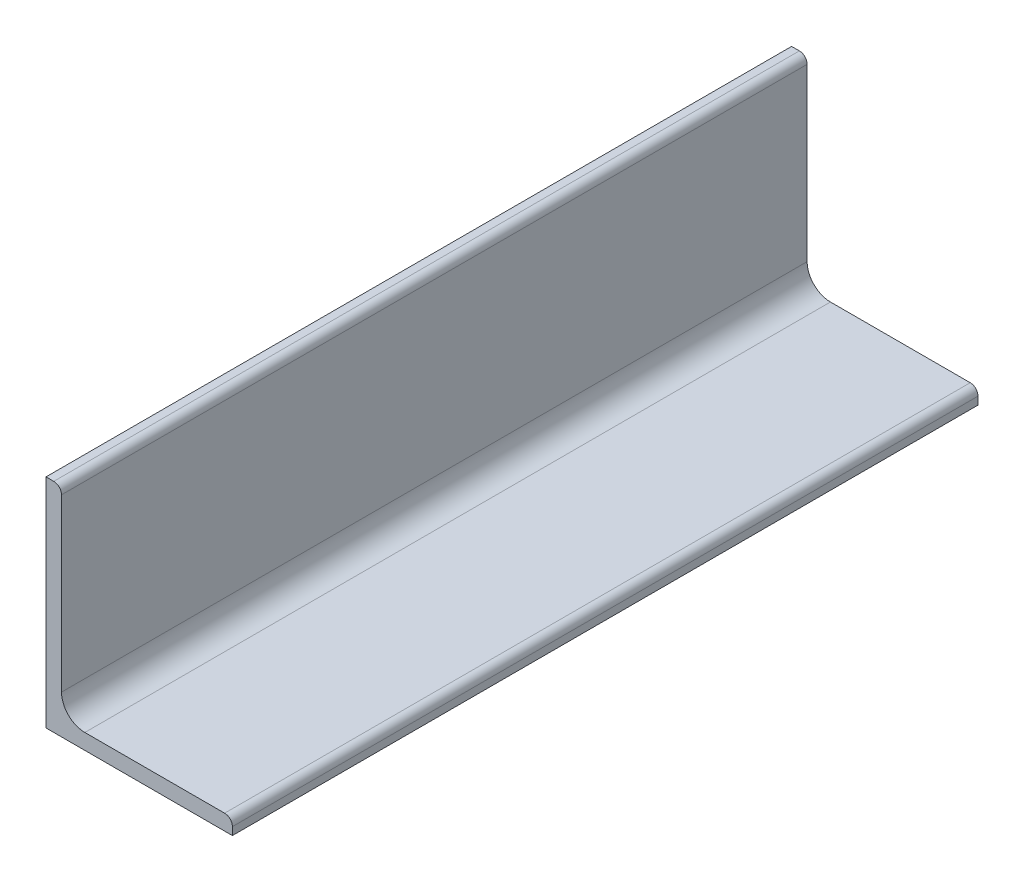
ISO-10303-21;
HEADER;
FILE_DESCRIPTION(('STEP AP214'),'2;1');
FILE_NAME('part.step','',(''),(''),'','','');
FILE_SCHEMA(('AUTOMOTIVE_DESIGN { 1 0 10303 214 1 1 1 1 }'));
ENDSEC;
DATA;
#1=APPLICATION_CONTEXT('core data for automotive mechanical design processes');
#2=APPLICATION_PROTOCOL_DEFINITION('international standard','automotive_design',2000,#1);
#3=PRODUCT_CONTEXT('',#1,'mechanical');
#4=PRODUCT('Part','Part','',(#3));
#5=PRODUCT_RELATED_PRODUCT_CATEGORY('part','',(#4));
#6=PRODUCT_DEFINITION_FORMATION('','',#4);
#7=PRODUCT_DEFINITION_CONTEXT('part definition',#1,'design');
#8=PRODUCT_DEFINITION('design','',#6,#7);
#9=PRODUCT_DEFINITION_SHAPE('','',#8);
#10=(LENGTH_UNIT() NAMED_UNIT(*) SI_UNIT(.MILLI.,.METRE.));
#11=(NAMED_UNIT(*) PLANE_ANGLE_UNIT() SI_UNIT($,.RADIAN.));
#12=(NAMED_UNIT(*) SI_UNIT($,.STERADIAN.) SOLID_ANGLE_UNIT());
#13=UNCERTAINTY_MEASURE_WITH_UNIT(LENGTH_MEASURE(1.E-05),#10,'distance_accuracy_value','');
#14=(GEOMETRIC_REPRESENTATION_CONTEXT(3) GLOBAL_UNCERTAINTY_ASSIGNED_CONTEXT((#13)) GLOBAL_UNIT_ASSIGNED_CONTEXT((#10,
#11,#12)) REPRESENTATION_CONTEXT('',''));
#15=CARTESIAN_POINT('',(0.,0.,0.));
#16=DIRECTION('',(0.,0.,1.));
#17=DIRECTION('',(1.,0.,0.));
#18=AXIS2_PLACEMENT_3D('',#15,#16,#17);
#19=CARTESIAN_POINT('',(0.490776827053332,89.7372005393545,304.8));
#20=DIRECTION('',(1.,0.,0.));
#21=DIRECTION('',(0.,0.,-1.));
#22=AXIS2_PLACEMENT_3D('',#19,#20,#21);
#23=PLANE('',#22);
#24=DIRECTION('',(0.,-1.,0.));
#25=VECTOR('',#24,1.);
#26=CARTESIAN_POINT('',(0.490776827053332,89.7372005393545,0.));
#27=LINE('',#26,#25);
#28=CARTESIAN_POINT('',(0.490776827053332,89.7372005393545,0.));
#29=VERTEX_POINT('',#28);
#30=CARTESIAN_POINT('',(0.490776827053332,0.837200539354535,0.));
#31=VERTEX_POINT('',#30);
#32=EDGE_CURVE('E135',#29,#31,#27,.T.);
#33=ORIENTED_EDGE('',*,*,#32,.T.);
#34=DIRECTION('',(0.,0.,-1.));
#35=VECTOR('',#34,1.);
#36=CARTESIAN_POINT('',(0.490776827053332,0.837200539354535,304.8));
#37=LINE('',#36,#35);
#38=CARTESIAN_POINT('',(0.490776827053332,0.837200539354535,304.8));
#39=VERTEX_POINT('',#38);
#40=EDGE_CURVE('E11',#39,#31,#37,.T.);
#41=ORIENTED_EDGE('',*,*,#40,.F.);
#42=DIRECTION('',(0.,-1.,0.));
#43=VECTOR('',#42,1.);
#44=CARTESIAN_POINT('',(0.490776827053332,89.7372005393545,304.8));
#45=LINE('',#44,#43);
#46=CARTESIAN_POINT('',(0.490776827053332,89.7372005393545,304.8));
#47=VERTEX_POINT('',#46);
#48=EDGE_CURVE('E151',#47,#39,#45,.T.);
#49=ORIENTED_EDGE('',*,*,#48,.F.);
#50=DIRECTION('',(0.,0.,-1.));
#51=VECTOR('',#50,1.);
#52=CARTESIAN_POINT('',(0.490776827053332,89.7372005393545,304.8));
#53=LINE('',#52,#51);
#54=EDGE_CURVE('E131',#47,#29,#53,.T.);
#55=ORIENTED_EDGE('',*,*,#54,.T.);
#56=EDGE_LOOP('',(#33,#41,#49,#55));
#57=FACE_BOUND('',#56,.T.);
#58=ADVANCED_FACE('F33',(#57),#23,.F.);
#59=CARTESIAN_POINT('',(0.490776827053332,0.837200539354535,304.8));
#60=DIRECTION('',(0.,1.,0.));
#61=DIRECTION('',(0.,0.,1.));
#62=AXIS2_PLACEMENT_3D('',#59,#60,#61);
#63=PLANE('',#62);
#64=DIRECTION('',(1.,0.,0.));
#65=VECTOR('',#64,1.);
#66=CARTESIAN_POINT('',(0.490776827053332,0.837200539354535,0.));
#67=LINE('',#66,#65);
#68=CARTESIAN_POINT('',(76.6907768270533,0.837200539354535,0.));
#69=VERTEX_POINT('',#68);
#70=EDGE_CURVE('E138',#31,#69,#67,.T.);
#71=ORIENTED_EDGE('',*,*,#70,.T.);
#72=DIRECTION('',(0.,0.,-1.));
#73=VECTOR('',#72,1.);
#74=CARTESIAN_POINT('',(76.6907768270533,0.837200539354535,304.8));
#75=LINE('',#74,#73);
#76=CARTESIAN_POINT('',(76.6907768270533,0.837200539354535,304.8));
#77=VERTEX_POINT('',#76);
#78=EDGE_CURVE('E41',#77,#69,#75,.T.);
#79=ORIENTED_EDGE('',*,*,#78,.F.);
#80=DIRECTION('',(1.,0.,0.));
#81=VECTOR('',#80,1.);
#82=CARTESIAN_POINT('',(0.490776827053332,0.837200539354535,304.8));
#83=LINE('',#82,#81);
#84=EDGE_CURVE('E95',#39,#77,#83,.T.);
#85=ORIENTED_EDGE('',*,*,#84,.F.);
#86=ORIENTED_EDGE('',*,*,#40,.T.);
#87=EDGE_LOOP('',(#71,#79,#85,#86));
#88=FACE_BOUND('',#87,.T.);
#89=ADVANCED_FACE('F194',(#88),#63,.F.);
#90=CARTESIAN_POINT('',(76.6907768270533,0.837200539354535,304.8));
#91=DIRECTION('',(-1.,0.,0.));
#92=DIRECTION('',(0.,0.,1.));
#93=AXIS2_PLACEMENT_3D('',#90,#91,#92);
#94=PLANE('',#93);
#95=DIRECTION('',(0.,1.,0.));
#96=VECTOR('',#95,1.);
#97=CARTESIAN_POINT('',(76.6907768270533,0.837200539354535,0.));
#98=LINE('',#97,#96);
#99=CARTESIAN_POINT('',(76.6907768270533,4.01220053935453,0.));
#100=VERTEX_POINT('',#99);
#101=EDGE_CURVE('E140',#69,#100,#98,.T.);
#102=ORIENTED_EDGE('',*,*,#101,.T.);
#103=DIRECTION('',(0.,0.,-1.));
#104=VECTOR('',#103,1.);
#105=CARTESIAN_POINT('',(76.6907768270533,4.01220053935453,304.8));
#106=LINE('',#105,#104);
#107=CARTESIAN_POINT('',(76.6907768270533,4.01220053935453,304.8));
#108=VERTEX_POINT('',#107);
#109=EDGE_CURVE('E161',#108,#100,#106,.T.);
#110=ORIENTED_EDGE('',*,*,#109,.F.);
#111=DIRECTION('',(0.,1.,0.));
#112=VECTOR('',#111,1.);
#113=CARTESIAN_POINT('',(76.6907768270533,0.837200539354535,304.8));
#114=LINE('',#113,#112);
#115=EDGE_CURVE('E169',#77,#108,#114,.T.);
#116=ORIENTED_EDGE('',*,*,#115,.F.);
#117=ORIENTED_EDGE('',*,*,#78,.T.);
#118=EDGE_LOOP('',(#102,#110,#116,#117));
#119=FACE_BOUND('',#118,.T.);
#120=ADVANCED_FACE('F167',(#119),#94,.F.);
#121=CARTESIAN_POINT('',(73.5157768270533,4.01220053935453,304.8));
#122=DIRECTION('',(0.,0.,-1.));
#123=DIRECTION('',(-1.,0.,0.));
#124=AXIS2_PLACEMENT_3D('',#121,#122,#123);
#125=CYLINDRICAL_SURFACE('',#124,3.175);
#126=CARTESIAN_POINT('',(73.5157768270533,4.01220053935453,0.));
#127=DIRECTION('',(0.,0.,1.));
#128=DIRECTION('',(1.,0.,0.));
#129=AXIS2_PLACEMENT_3D('',#126,#127,#128);
#130=CIRCLE('',#129,3.175);
#131=CARTESIAN_POINT('',(73.5157768270533,7.18720053935453,0.));
#132=VERTEX_POINT('',#131);
#133=EDGE_CURVE('E142',#100,#132,#130,.T.);
#134=ORIENTED_EDGE('',*,*,#133,.T.);
#135=DIRECTION('',(0.,0.,-1.));
#136=VECTOR('',#135,1.);
#137=CARTESIAN_POINT('',(73.5157768270533,7.18720053935453,304.8));
#138=LINE('',#137,#136);
#139=CARTESIAN_POINT('',(73.5157768270533,7.18720053935453,304.8));
#140=VERTEX_POINT('',#139);
#141=EDGE_CURVE('E158',#140,#132,#138,.T.);
#142=ORIENTED_EDGE('',*,*,#141,.F.);
#143=CARTESIAN_POINT('',(73.5157768270533,4.01220053935453,304.8));
#144=DIRECTION('',(0.,0.,1.));
#145=DIRECTION('',(1.,0.,0.));
#146=AXIS2_PLACEMENT_3D('',#143,#144,#145);
#147=CIRCLE('',#146,3.175);
#148=EDGE_CURVE('E185',#108,#140,#147,.T.);
#149=ORIENTED_EDGE('',*,*,#148,.F.);
#150=ORIENTED_EDGE('',*,*,#109,.T.);
#151=EDGE_LOOP('',(#134,#142,#149,#150));
#152=FACE_BOUND('',#151,.T.);
#153=ADVANCED_FACE('F178',(#152),#125,.T.);
#154=CARTESIAN_POINT('',(73.5157768270533,7.18720053935453,304.8));
#155=DIRECTION('',(0.,-1.,0.));
#156=DIRECTION('',(0.,0.,-1.));
#157=AXIS2_PLACEMENT_3D('',#154,#155,#156);
#158=PLANE('',#157);
#159=DIRECTION('',(-1.,0.,0.));
#160=VECTOR('',#159,1.);
#161=CARTESIAN_POINT('',(73.5157768270533,7.18720053935453,0.));
#162=LINE('',#161,#160);
#163=CARTESIAN_POINT('',(16.3657768270533,7.18720053935453,0.));
#164=VERTEX_POINT('',#163);
#165=EDGE_CURVE('E144',#132,#164,#162,.T.);
#166=ORIENTED_EDGE('',*,*,#165,.T.);
#167=DIRECTION('',(0.,0.,-1.));
#168=VECTOR('',#167,1.);
#169=CARTESIAN_POINT('',(16.3657768270533,7.18720053935453,304.8));
#170=LINE('',#169,#168);
#171=CARTESIAN_POINT('',(16.3657768270533,7.18720053935453,304.8));
#172=VERTEX_POINT('',#171);
#173=EDGE_CURVE('E155',#172,#164,#170,.T.);
#174=ORIENTED_EDGE('',*,*,#173,.F.);
#175=DIRECTION('',(-1.,0.,0.));
#176=VECTOR('',#175,1.);
#177=CARTESIAN_POINT('',(73.5157768270533,7.18720053935453,304.8));
#178=LINE('',#177,#176);
#179=EDGE_CURVE('E184',#140,#172,#178,.T.);
#180=ORIENTED_EDGE('',*,*,#179,.F.);
#181=ORIENTED_EDGE('',*,*,#141,.T.);
#182=EDGE_LOOP('',(#166,#174,#180,#181));
#183=FACE_BOUND('',#182,.T.);
#184=ADVANCED_FACE('F182',(#183),#158,.F.);
#185=CARTESIAN_POINT('',(16.3657768270533,16.7122005393545,304.8));
#186=DIRECTION('',(0.,0.,-1.));
#187=DIRECTION('',(-1.,0.,0.));
#188=AXIS2_PLACEMENT_3D('',#185,#186,#187);
#189=CYLINDRICAL_SURFACE('',#188,9.52499999999999);
#190=CARTESIAN_POINT('',(16.3657768270533,16.7122005393545,0.));
#191=DIRECTION('',(0.,0.,-1.));
#192=DIRECTION('',(1.,0.,0.));
#193=AXIS2_PLACEMENT_3D('',#190,#191,#192);
#194=CIRCLE('',#193,9.52499999999999);
#195=CARTESIAN_POINT('',(6.84077682705333,16.7122005393545,0.));
#196=VERTEX_POINT('',#195);
#197=EDGE_CURVE('E146',#164,#196,#194,.T.);
#198=ORIENTED_EDGE('',*,*,#197,.T.);
#199=DIRECTION('',(0.,0.,-1.));
#200=VECTOR('',#199,1.);
#201=CARTESIAN_POINT('',(6.84077682705333,16.7122005393545,304.8));
#202=LINE('',#201,#200);
#203=CARTESIAN_POINT('',(6.84077682705333,16.7122005393545,304.8));
#204=VERTEX_POINT('',#203);
#205=EDGE_CURVE('E126',#204,#196,#202,.T.);
#206=ORIENTED_EDGE('',*,*,#205,.F.);
#207=CARTESIAN_POINT('',(16.3657768270533,16.7122005393545,304.8));
#208=DIRECTION('',(0.,0.,-1.));
#209=DIRECTION('',(1.,0.,0.));
#210=AXIS2_PLACEMENT_3D('',#207,#208,#209);
#211=CIRCLE('',#210,9.52499999999999);
#212=EDGE_CURVE('E117',#172,#204,#211,.T.);
#213=ORIENTED_EDGE('',*,*,#212,.F.);
#214=ORIENTED_EDGE('',*,*,#173,.T.);
#215=EDGE_LOOP('',(#198,#206,#213,#214));
#216=FACE_BOUND('',#215,.T.);
#217=ADVANCED_FACE('F206',(#216),#189,.F.);
#218=CARTESIAN_POINT('',(6.84077682705333,16.7122005393545,304.8));
#219=DIRECTION('',(-1.,0.,0.));
#220=DIRECTION('',(0.,0.,1.));
#221=AXIS2_PLACEMENT_3D('',#218,#219,#220);
#222=PLANE('',#221);
#223=DIRECTION('',(0.,1.,0.));
#224=VECTOR('',#223,1.);
#225=CARTESIAN_POINT('',(6.84077682705333,16.7122005393545,0.));
#226=LINE('',#225,#224);
#227=CARTESIAN_POINT('',(6.84077682705333,86.5622005393545,0.));
#228=VERTEX_POINT('',#227);
#229=EDGE_CURVE('E125',#196,#228,#226,.T.);
#230=ORIENTED_EDGE('',*,*,#229,.T.);
#231=DIRECTION('',(0.,0.,-1.));
#232=VECTOR('',#231,1.);
#233=CARTESIAN_POINT('',(6.84077682705333,86.5622005393545,304.8));
#234=LINE('',#233,#232);
#235=CARTESIAN_POINT('',(6.84077682705333,86.5622005393545,304.8));
#236=VERTEX_POINT('',#235);
#237=EDGE_CURVE('E122',#236,#228,#234,.T.);
#238=ORIENTED_EDGE('',*,*,#237,.F.);
#239=DIRECTION('',(0.,1.,0.));
#240=VECTOR('',#239,1.);
#241=CARTESIAN_POINT('',(6.84077682705333,16.7122005393545,304.8));
#242=LINE('',#241,#240);
#243=EDGE_CURVE('E111',#204,#236,#242,.T.);
#244=ORIENTED_EDGE('',*,*,#243,.F.);
#245=ORIENTED_EDGE('',*,*,#205,.T.);
#246=EDGE_LOOP('',(#230,#238,#244,#245));
#247=FACE_BOUND('',#246,.T.);
#248=ADVANCED_FACE('F123',(#247),#222,.F.);
#249=CARTESIAN_POINT('',(3.66577682705333,86.5622005393545,304.8));
#250=DIRECTION('',(0.,0.,-1.));
#251=DIRECTION('',(-1.,0.,0.));
#252=AXIS2_PLACEMENT_3D('',#249,#250,#251);
#253=CYLINDRICAL_SURFACE('',#252,3.17500000000001);
#254=CARTESIAN_POINT('',(3.66577682705333,86.5622005393545,0.));
#255=DIRECTION('',(0.,0.,1.));
#256=DIRECTION('',(1.,0.,0.));
#257=AXIS2_PLACEMENT_3D('',#254,#255,#256);
#258=CIRCLE('',#257,3.17500000000001);
#259=CARTESIAN_POINT('',(3.66577682705333,89.7372005393545,0.));
#260=VERTEX_POINT('',#259);
#261=EDGE_CURVE('E81',#228,#260,#258,.T.);
#262=ORIENTED_EDGE('',*,*,#261,.T.);
#263=DIRECTION('',(0.,0.,-1.));
#264=VECTOR('',#263,1.);
#265=CARTESIAN_POINT('',(3.66577682705333,89.7372005393545,304.8));
#266=LINE('',#265,#264);
#267=CARTESIAN_POINT('',(3.66577682705333,89.7372005393545,304.8));
#268=VERTEX_POINT('',#267);
#269=EDGE_CURVE('E127',#268,#260,#266,.T.);
#270=ORIENTED_EDGE('',*,*,#269,.F.);
#271=CARTESIAN_POINT('',(3.66577682705333,86.5622005393545,304.8));
#272=DIRECTION('',(0.,0.,1.));
#273=DIRECTION('',(1.,0.,0.));
#274=AXIS2_PLACEMENT_3D('',#271,#272,#273);
#275=CIRCLE('',#274,3.17500000000001);
#276=EDGE_CURVE('E115',#236,#268,#275,.T.);
#277=ORIENTED_EDGE('',*,*,#276,.F.);
#278=ORIENTED_EDGE('',*,*,#237,.T.);
#279=EDGE_LOOP('',(#262,#270,#277,#278));
#280=FACE_BOUND('',#279,.T.);
#281=ADVANCED_FACE('F129',(#280),#253,.T.);
#282=CARTESIAN_POINT('',(3.66577682705333,89.7372005393545,304.8));
#283=DIRECTION('',(0.,-1.,0.));
#284=DIRECTION('',(0.,0.,-1.));
#285=AXIS2_PLACEMENT_3D('',#282,#283,#284);
#286=PLANE('',#285);
#287=DIRECTION('',(-1.,0.,0.));
#288=VECTOR('',#287,1.);
#289=CARTESIAN_POINT('',(3.66577682705333,89.7372005393545,0.));
#290=LINE('',#289,#288);
#291=EDGE_CURVE('E87',#260,#29,#290,.T.);
#292=ORIENTED_EDGE('',*,*,#291,.T.);
#293=ORIENTED_EDGE('',*,*,#54,.F.);
#294=DIRECTION('',(-1.,0.,0.));
#295=VECTOR('',#294,1.);
#296=CARTESIAN_POINT('',(3.66577682705333,89.7372005393545,304.8));
#297=LINE('',#296,#295);
#298=EDGE_CURVE('E49',#268,#47,#297,.T.);
#299=ORIENTED_EDGE('',*,*,#298,.F.);
#300=ORIENTED_EDGE('',*,*,#269,.T.);
#301=EDGE_LOOP('',(#292,#293,#299,#300));
#302=FACE_BOUND('',#301,.T.);
#303=ADVANCED_FACE('F214',(#302),#286,.F.);
#304=CARTESIAN_POINT('',(73.5157768270533,4.01220053935453,304.8));
#305=DIRECTION('',(0.,0.,1.));
#306=DIRECTION('',(1.,0.,0.));
#307=AXIS2_PLACEMENT_3D('',#304,#305,#306);
#308=PLANE('',#307);
#309=ORIENTED_EDGE('',*,*,#48,.T.);
#310=ORIENTED_EDGE('',*,*,#84,.T.);
#311=ORIENTED_EDGE('',*,*,#115,.T.);
#312=ORIENTED_EDGE('',*,*,#148,.T.);
#313=ORIENTED_EDGE('',*,*,#179,.T.);
#314=ORIENTED_EDGE('',*,*,#212,.T.);
#315=ORIENTED_EDGE('',*,*,#243,.T.);
#316=ORIENTED_EDGE('',*,*,#276,.T.);
#317=ORIENTED_EDGE('',*,*,#298,.T.);
#318=EDGE_LOOP('',(#309,#310,#311,#312,#313,#314,#315,#316,#317));
#319=FACE_BOUND('',#318,.T.);
#320=ADVANCED_FACE('F113',(#319),#308,.T.);
#321=CARTESIAN_POINT('',(73.5157768270533,4.01220053935453,0.));
#322=DIRECTION('',(0.,0.,1.));
#323=DIRECTION('',(1.,0.,0.));
#324=AXIS2_PLACEMENT_3D('',#321,#322,#323);
#325=PLANE('',#324);
#326=ORIENTED_EDGE('',*,*,#32,.F.);
#327=ORIENTED_EDGE('',*,*,#291,.F.);
#328=ORIENTED_EDGE('',*,*,#261,.F.);
#329=ORIENTED_EDGE('',*,*,#229,.F.);
#330=ORIENTED_EDGE('',*,*,#197,.F.);
#331=ORIENTED_EDGE('',*,*,#165,.F.);
#332=ORIENTED_EDGE('',*,*,#133,.F.);
#333=ORIENTED_EDGE('',*,*,#101,.F.);
#334=ORIENTED_EDGE('',*,*,#70,.F.);
#335=EDGE_LOOP('',(#326,#327,#328,#329,#330,#331,#332,#333,#334));
#336=FACE_BOUND('',#335,.T.);
#337=ADVANCED_FACE('F173',(#336),#325,.F.);
#338=CLOSED_SHELL('',(#58,#89,#120,#153,#184,#217,#248,#281,#303,#320,#337));
#339=MANIFOLD_SOLID_BREP('B2',#338);
#340=ADVANCED_BREP_SHAPE_REPRESENTATION('',(#18,#339),#14);
#341=SHAPE_DEFINITION_REPRESENTATION(#9,#340);
ENDSEC;
END-ISO-10303-21;
